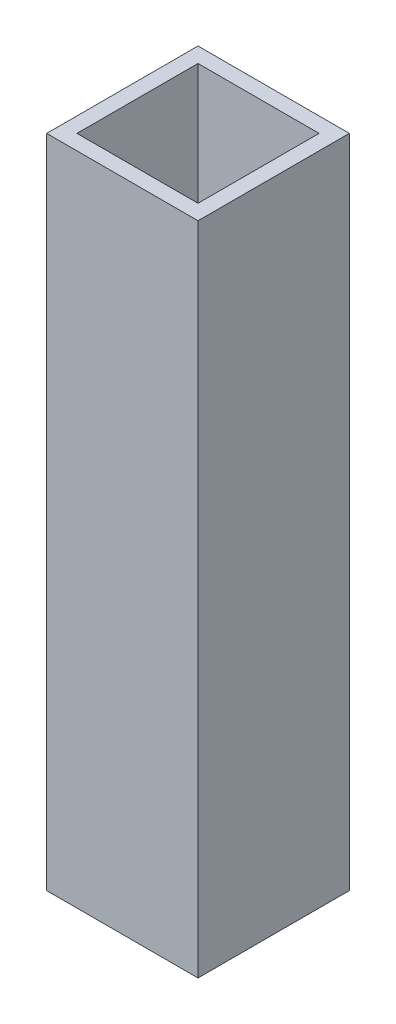
ISO-10303-21;
HEADER;
FILE_DESCRIPTION(('STEP AP214'),'2;1');
FILE_NAME('part.step','',(''),(''),'','','');
FILE_SCHEMA(('AUTOMOTIVE_DESIGN { 1 0 10303 214 1 1 1 1 }'));
ENDSEC;
DATA;
#1=APPLICATION_CONTEXT('core data for automotive mechanical design processes');
#2=APPLICATION_PROTOCOL_DEFINITION('international standard','automotive_design',2000,#1);
#3=PRODUCT_CONTEXT('',#1,'mechanical');
#4=PRODUCT('Part','Part','',(#3));
#5=PRODUCT_RELATED_PRODUCT_CATEGORY('part','',(#4));
#6=PRODUCT_DEFINITION_FORMATION('','',#4);
#7=PRODUCT_DEFINITION_CONTEXT('part definition',#1,'design');
#8=PRODUCT_DEFINITION('design','',#6,#7);
#9=PRODUCT_DEFINITION_SHAPE('','',#8);
#10=(LENGTH_UNIT() NAMED_UNIT(*) SI_UNIT(.MILLI.,.METRE.));
#11=(NAMED_UNIT(*) PLANE_ANGLE_UNIT() SI_UNIT($,.RADIAN.));
#12=(NAMED_UNIT(*) SI_UNIT($,.STERADIAN.) SOLID_ANGLE_UNIT());
#13=UNCERTAINTY_MEASURE_WITH_UNIT(LENGTH_MEASURE(1.E-05),#10,'distance_accuracy_value','');
#14=(GEOMETRIC_REPRESENTATION_CONTEXT(3) GLOBAL_UNCERTAINTY_ASSIGNED_CONTEXT((#13)) GLOBAL_UNIT_ASSIGNED_CONTEXT((#10,
#11,#12)) REPRESENTATION_CONTEXT('',''));
#15=CARTESIAN_POINT('',(0.,0.,0.));
#16=DIRECTION('',(0.,0.,1.));
#17=DIRECTION('',(1.,0.,0.));
#18=AXIS2_PLACEMENT_3D('',#15,#16,#17);
#19=CARTESIAN_POINT('',(0.,130.,0.));
#20=DIRECTION('',(0.,1.,0.));
#21=DIRECTION('',(0.,0.,1.));
#22=AXIS2_PLACEMENT_3D('',#19,#20,#21);
#23=PLANE('',#22);
#24=DIRECTION('',(0.,0.,-1.));
#25=VECTOR('',#24,1.);
#26=CARTESIAN_POINT('',(15.,130.,-15.));
#27=LINE('',#26,#25);
#28=CARTESIAN_POINT('',(15.,130.,15.));
#29=VERTEX_POINT('',#28);
#30=CARTESIAN_POINT('',(15.,130.,-15.));
#31=VERTEX_POINT('',#30);
#32=EDGE_CURVE('E134',#29,#31,#27,.T.);
#33=ORIENTED_EDGE('',*,*,#32,.T.);
#34=DIRECTION('',(-1.,0.,0.));
#35=VECTOR('',#34,1.);
#36=CARTESIAN_POINT('',(-15.,130.,-15.));
#37=LINE('',#36,#35);
#38=CARTESIAN_POINT('',(-15.,130.,-15.));
#39=VERTEX_POINT('',#38);
#40=EDGE_CURVE('E137',#31,#39,#37,.T.);
#41=ORIENTED_EDGE('',*,*,#40,.T.);
#42=DIRECTION('',(0.,0.,1.));
#43=VECTOR('',#42,1.);
#44=CARTESIAN_POINT('',(-15.,130.,-15.));
#45=LINE('',#44,#43);
#46=CARTESIAN_POINT('',(-15.,130.,15.));
#47=VERTEX_POINT('',#46);
#48=EDGE_CURVE('E140',#39,#47,#45,.T.);
#49=ORIENTED_EDGE('',*,*,#48,.T.);
#50=DIRECTION('',(1.,0.,0.));
#51=VECTOR('',#50,1.);
#52=CARTESIAN_POINT('',(-15.,130.,15.));
#53=LINE('',#52,#51);
#54=EDGE_CURVE('E142',#47,#29,#53,.T.);
#55=ORIENTED_EDGE('',*,*,#54,.T.);
#56=EDGE_LOOP('',(#33,#41,#49,#55));
#57=FACE_BOUND('',#56,.T.);
#58=DIRECTION('',(-1.,0.,0.));
#59=VECTOR('',#58,1.);
#60=CARTESIAN_POINT('',(-12.,130.,-12.));
#61=LINE('',#60,#59);
#62=CARTESIAN_POINT('',(12.,130.,-12.));
#63=VERTEX_POINT('',#62);
#64=CARTESIAN_POINT('',(-12.,130.,-12.));
#65=VERTEX_POINT('',#64);
#66=EDGE_CURVE('E106',#63,#65,#61,.T.);
#67=ORIENTED_EDGE('',*,*,#66,.F.);
#68=DIRECTION('',(0.,0.,-1.));
#69=VECTOR('',#68,1.);
#70=CARTESIAN_POINT('',(12.,130.,-12.));
#71=LINE('',#70,#69);
#72=CARTESIAN_POINT('',(12.,130.,12.));
#73=VERTEX_POINT('',#72);
#74=EDGE_CURVE('E98',#73,#63,#71,.T.);
#75=ORIENTED_EDGE('',*,*,#74,.F.);
#76=DIRECTION('',(1.,0.,0.));
#77=VECTOR('',#76,1.);
#78=CARTESIAN_POINT('',(-12.,130.,12.));
#79=LINE('',#78,#77);
#80=CARTESIAN_POINT('',(-12.,130.,12.));
#81=VERTEX_POINT('',#80);
#82=EDGE_CURVE('E120',#81,#73,#79,.T.);
#83=ORIENTED_EDGE('',*,*,#82,.F.);
#84=DIRECTION('',(0.,0.,1.));
#85=VECTOR('',#84,1.);
#86=CARTESIAN_POINT('',(-12.,130.,-12.));
#87=LINE('',#86,#85);
#88=EDGE_CURVE('E118',#65,#81,#87,.T.);
#89=ORIENTED_EDGE('',*,*,#88,.F.);
#90=EDGE_LOOP('',(#67,#75,#83,#89));
#91=FACE_BOUND('',#90,.T.);
#92=ADVANCED_FACE('F33',(#57,#91),#23,.T.);
#93=CARTESIAN_POINT('',(0.,0.,0.));
#94=DIRECTION('',(0.,1.,0.));
#95=DIRECTION('',(0.,0.,1.));
#96=AXIS2_PLACEMENT_3D('',#93,#94,#95);
#97=PLANE('',#96);
#98=DIRECTION('',(0.,0.,-1.));
#99=VECTOR('',#98,1.);
#100=CARTESIAN_POINT('',(15.,0.,-15.));
#101=LINE('',#100,#99);
#102=CARTESIAN_POINT('',(15.,0.,15.));
#103=VERTEX_POINT('',#102);
#104=CARTESIAN_POINT('',(15.,0.,-15.));
#105=VERTEX_POINT('',#104);
#106=EDGE_CURVE('E114',#103,#105,#101,.T.);
#107=ORIENTED_EDGE('',*,*,#106,.F.);
#108=DIRECTION('',(1.,0.,0.));
#109=VECTOR('',#108,1.);
#110=CARTESIAN_POINT('',(-15.,0.,15.));
#111=LINE('',#110,#109);
#112=CARTESIAN_POINT('',(-15.,0.,15.));
#113=VERTEX_POINT('',#112);
#114=EDGE_CURVE('E138',#113,#103,#111,.T.);
#115=ORIENTED_EDGE('',*,*,#114,.F.);
#116=DIRECTION('',(0.,0.,1.));
#117=VECTOR('',#116,1.);
#118=CARTESIAN_POINT('',(-15.,0.,-15.));
#119=LINE('',#118,#117);
#120=CARTESIAN_POINT('',(-15.,0.,-15.));
#121=VERTEX_POINT('',#120);
#122=EDGE_CURVE('E149',#121,#113,#119,.T.);
#123=ORIENTED_EDGE('',*,*,#122,.F.);
#124=DIRECTION('',(-1.,0.,0.));
#125=VECTOR('',#124,1.);
#126=CARTESIAN_POINT('',(-15.,0.,-15.));
#127=LINE('',#126,#125);
#128=EDGE_CURVE('E147',#105,#121,#127,.T.);
#129=ORIENTED_EDGE('',*,*,#128,.F.);
#130=EDGE_LOOP('',(#107,#115,#123,#129));
#131=FACE_BOUND('',#130,.T.);
#132=DIRECTION('',(0.,0.,-1.));
#133=VECTOR('',#132,1.);
#134=CARTESIAN_POINT('',(12.,0.,-12.));
#135=LINE('',#134,#133);
#136=CARTESIAN_POINT('',(12.,0.,12.));
#137=VERTEX_POINT('',#136);
#138=CARTESIAN_POINT('',(12.,0.,-12.));
#139=VERTEX_POINT('',#138);
#140=EDGE_CURVE('E56',#137,#139,#135,.T.);
#141=ORIENTED_EDGE('',*,*,#140,.T.);
#142=DIRECTION('',(-1.,0.,0.));
#143=VECTOR('',#142,1.);
#144=CARTESIAN_POINT('',(-12.,0.,-12.));
#145=LINE('',#144,#143);
#146=CARTESIAN_POINT('',(-12.,0.,-12.));
#147=VERTEX_POINT('',#146);
#148=EDGE_CURVE('E113',#139,#147,#145,.T.);
#149=ORIENTED_EDGE('',*,*,#148,.T.);
#150=DIRECTION('',(0.,0.,1.));
#151=VECTOR('',#150,1.);
#152=CARTESIAN_POINT('',(-12.,0.,-12.));
#153=LINE('',#152,#151);
#154=CARTESIAN_POINT('',(-12.,0.,12.));
#155=VERTEX_POINT('',#154);
#156=EDGE_CURVE('E126',#147,#155,#153,.T.);
#157=ORIENTED_EDGE('',*,*,#156,.T.);
#158=DIRECTION('',(1.,0.,0.));
#159=VECTOR('',#158,1.);
#160=CARTESIAN_POINT('',(-12.,0.,12.));
#161=LINE('',#160,#159);
#162=EDGE_CURVE('E107',#155,#137,#161,.T.);
#163=ORIENTED_EDGE('',*,*,#162,.T.);
#164=EDGE_LOOP('',(#141,#149,#157,#163));
#165=FACE_BOUND('',#164,.T.);
#166=ADVANCED_FACE('F167',(#131,#165),#97,.F.);
#167=CARTESIAN_POINT('',(15.,130.,-15.));
#168=DIRECTION('',(-1.,0.,0.));
#169=DIRECTION('',(0.,0.,1.));
#170=AXIS2_PLACEMENT_3D('',#167,#168,#169);
#171=PLANE('',#170);
#172=ORIENTED_EDGE('',*,*,#106,.T.);
#173=DIRECTION('',(0.,-1.,0.));
#174=VECTOR('',#173,1.);
#175=CARTESIAN_POINT('',(15.,130.,-15.));
#176=LINE('',#175,#174);
#177=EDGE_CURVE('E11',#31,#105,#176,.T.);
#178=ORIENTED_EDGE('',*,*,#177,.F.);
#179=ORIENTED_EDGE('',*,*,#32,.F.);
#180=DIRECTION('',(0.,-1.,0.));
#181=VECTOR('',#180,1.);
#182=CARTESIAN_POINT('',(15.,130.,15.));
#183=LINE('',#182,#181);
#184=EDGE_CURVE('E144',#29,#103,#183,.T.);
#185=ORIENTED_EDGE('',*,*,#184,.T.);
#186=EDGE_LOOP('',(#172,#178,#179,#185));
#187=FACE_BOUND('',#186,.T.);
#188=ADVANCED_FACE('F35',(#187),#171,.F.);
#189=CARTESIAN_POINT('',(-15.,130.,-15.));
#190=DIRECTION('',(0.,0.,1.));
#191=DIRECTION('',(1.,0.,0.));
#192=AXIS2_PLACEMENT_3D('',#189,#190,#191);
#193=PLANE('',#192);
#194=ORIENTED_EDGE('',*,*,#128,.T.);
#195=DIRECTION('',(0.,-1.,0.));
#196=VECTOR('',#195,1.);
#197=CARTESIAN_POINT('',(-15.,130.,-15.));
#198=LINE('',#197,#196);
#199=EDGE_CURVE('E41',#39,#121,#198,.T.);
#200=ORIENTED_EDGE('',*,*,#199,.F.);
#201=ORIENTED_EDGE('',*,*,#40,.F.);
#202=ORIENTED_EDGE('',*,*,#177,.T.);
#203=EDGE_LOOP('',(#194,#200,#201,#202));
#204=FACE_BOUND('',#203,.T.);
#205=ADVANCED_FACE('F177',(#204),#193,.F.);
#206=CARTESIAN_POINT('',(-15.,130.,-15.));
#207=DIRECTION('',(1.,0.,0.));
#208=DIRECTION('',(0.,0.,-1.));
#209=AXIS2_PLACEMENT_3D('',#206,#207,#208);
#210=PLANE('',#209);
#211=ORIENTED_EDGE('',*,*,#122,.T.);
#212=DIRECTION('',(0.,-1.,0.));
#213=VECTOR('',#212,1.);
#214=CARTESIAN_POINT('',(-15.,130.,15.));
#215=LINE('',#214,#213);
#216=EDGE_CURVE('E154',#47,#113,#215,.T.);
#217=ORIENTED_EDGE('',*,*,#216,.F.);
#218=ORIENTED_EDGE('',*,*,#48,.F.);
#219=ORIENTED_EDGE('',*,*,#199,.T.);
#220=EDGE_LOOP('',(#211,#217,#218,#219));
#221=FACE_BOUND('',#220,.T.);
#222=ADVANCED_FACE('F161',(#221),#210,.F.);
#223=CARTESIAN_POINT('',(-15.,130.,15.));
#224=DIRECTION('',(0.,0.,-1.));
#225=DIRECTION('',(-1.,0.,0.));
#226=AXIS2_PLACEMENT_3D('',#223,#224,#225);
#227=PLANE('',#226);
#228=ORIENTED_EDGE('',*,*,#114,.T.);
#229=ORIENTED_EDGE('',*,*,#184,.F.);
#230=ORIENTED_EDGE('',*,*,#54,.F.);
#231=ORIENTED_EDGE('',*,*,#216,.T.);
#232=EDGE_LOOP('',(#228,#229,#230,#231));
#233=FACE_BOUND('',#232,.T.);
#234=ADVANCED_FACE('F171',(#233),#227,.F.);
#235=CARTESIAN_POINT('',(12.,130.,-12.));
#236=DIRECTION('',(-1.,0.,0.));
#237=DIRECTION('',(0.,0.,1.));
#238=AXIS2_PLACEMENT_3D('',#235,#236,#237);
#239=PLANE('',#238);
#240=ORIENTED_EDGE('',*,*,#140,.F.);
#241=DIRECTION('',(0.,-1.,0.));
#242=VECTOR('',#241,1.);
#243=CARTESIAN_POINT('',(12.,130.,12.));
#244=LINE('',#243,#242);
#245=EDGE_CURVE('E102',#73,#137,#244,.T.);
#246=ORIENTED_EDGE('',*,*,#245,.F.);
#247=ORIENTED_EDGE('',*,*,#74,.T.);
#248=DIRECTION('',(0.,-1.,0.));
#249=VECTOR('',#248,1.);
#250=CARTESIAN_POINT('',(12.,130.,-12.));
#251=LINE('',#250,#249);
#252=EDGE_CURVE('E101',#63,#139,#251,.T.);
#253=ORIENTED_EDGE('',*,*,#252,.T.);
#254=EDGE_LOOP('',(#240,#246,#247,#253));
#255=FACE_BOUND('',#254,.T.);
#256=ADVANCED_FACE('F100',(#255),#239,.T.);
#257=CARTESIAN_POINT('',(-12.,130.,-12.));
#258=DIRECTION('',(0.,0.,1.));
#259=DIRECTION('',(1.,0.,0.));
#260=AXIS2_PLACEMENT_3D('',#257,#258,#259);
#261=PLANE('',#260);
#262=ORIENTED_EDGE('',*,*,#148,.F.);
#263=ORIENTED_EDGE('',*,*,#252,.F.);
#264=ORIENTED_EDGE('',*,*,#66,.T.);
#265=DIRECTION('',(0.,-1.,0.));
#266=VECTOR('',#265,1.);
#267=CARTESIAN_POINT('',(-12.,130.,-12.));
#268=LINE('',#267,#266);
#269=EDGE_CURVE('E115',#65,#147,#268,.T.);
#270=ORIENTED_EDGE('',*,*,#269,.T.);
#271=EDGE_LOOP('',(#262,#263,#264,#270));
#272=FACE_BOUND('',#271,.T.);
#273=ADVANCED_FACE('F110',(#272),#261,.T.);
#274=CARTESIAN_POINT('',(-12.,130.,-12.));
#275=DIRECTION('',(1.,0.,0.));
#276=DIRECTION('',(0.,0.,-1.));
#277=AXIS2_PLACEMENT_3D('',#274,#275,#276);
#278=PLANE('',#277);
#279=ORIENTED_EDGE('',*,*,#156,.F.);
#280=ORIENTED_EDGE('',*,*,#269,.F.);
#281=ORIENTED_EDGE('',*,*,#88,.T.);
#282=DIRECTION('',(0.,-1.,0.));
#283=VECTOR('',#282,1.);
#284=CARTESIAN_POINT('',(-12.,130.,12.));
#285=LINE('',#284,#283);
#286=EDGE_CURVE('E48',#81,#155,#285,.T.);
#287=ORIENTED_EDGE('',*,*,#286,.T.);
#288=EDGE_LOOP('',(#279,#280,#281,#287));
#289=FACE_BOUND('',#288,.T.);
#290=ADVANCED_FACE('F200',(#289),#278,.T.);
#291=CARTESIAN_POINT('',(-12.,130.,12.));
#292=DIRECTION('',(0.,0.,-1.));
#293=DIRECTION('',(-1.,0.,0.));
#294=AXIS2_PLACEMENT_3D('',#291,#292,#293);
#295=PLANE('',#294);
#296=ORIENTED_EDGE('',*,*,#162,.F.);
#297=ORIENTED_EDGE('',*,*,#286,.F.);
#298=ORIENTED_EDGE('',*,*,#82,.T.);
#299=ORIENTED_EDGE('',*,*,#245,.T.);
#300=EDGE_LOOP('',(#296,#297,#298,#299));
#301=FACE_BOUND('',#300,.T.);
#302=ADVANCED_FACE('F204',(#301),#295,.T.);
#303=CLOSED_SHELL('',(#92,#166,#188,#205,#222,#234,#256,#273,#290,#302));
#304=MANIFOLD_SOLID_BREP('B2',#303);
#305=ADVANCED_BREP_SHAPE_REPRESENTATION('',(#18,#304),#14);
#306=SHAPE_DEFINITION_REPRESENTATION(#9,#305);
ENDSEC;
END-ISO-10303-21;
